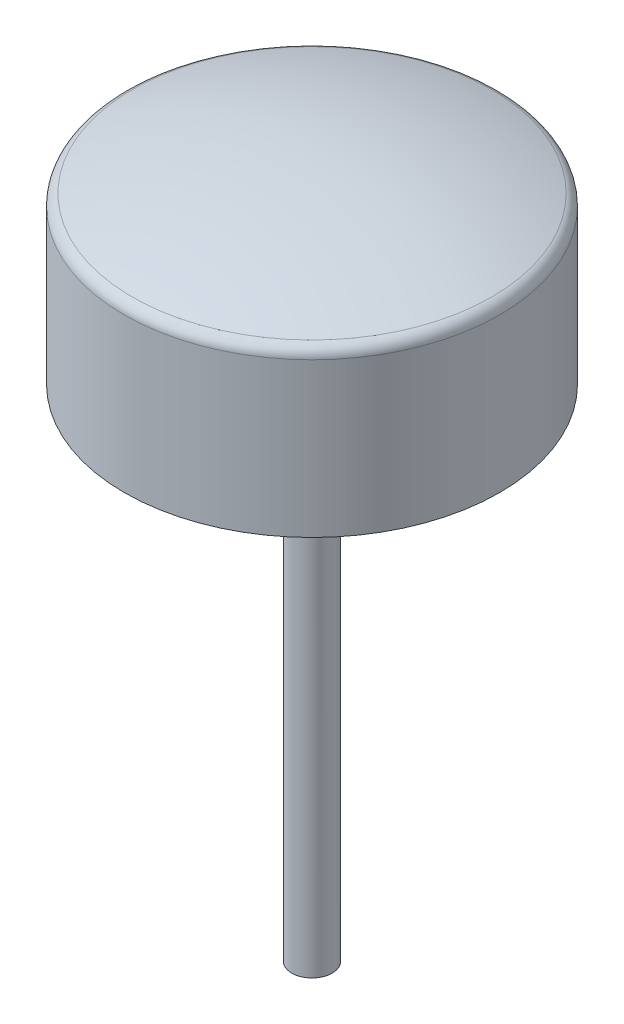
ISO-10303-21;
HEADER;
FILE_DESCRIPTION(('STEP AP214'),'2;1');
FILE_NAME('part.step','',(''),(''),'','','');
FILE_SCHEMA(('AUTOMOTIVE_DESIGN { 1 0 10303 214 1 1 1 1 }'));
ENDSEC;
DATA;
#1=APPLICATION_CONTEXT('core data for automotive mechanical design processes');
#2=APPLICATION_PROTOCOL_DEFINITION('international standard','automotive_design',2000,#1);
#3=PRODUCT_CONTEXT('',#1,'mechanical');
#4=PRODUCT('Part','Part','',(#3));
#5=PRODUCT_RELATED_PRODUCT_CATEGORY('part','',(#4));
#6=PRODUCT_DEFINITION_FORMATION('','',#4);
#7=PRODUCT_DEFINITION_CONTEXT('part definition',#1,'design');
#8=PRODUCT_DEFINITION('design','',#6,#7);
#9=PRODUCT_DEFINITION_SHAPE('','',#8);
#10=(LENGTH_UNIT() NAMED_UNIT(*) SI_UNIT(.MILLI.,.METRE.));
#11=(NAMED_UNIT(*) PLANE_ANGLE_UNIT() SI_UNIT($,.RADIAN.));
#12=(NAMED_UNIT(*) SI_UNIT($,.STERADIAN.) SOLID_ANGLE_UNIT());
#13=UNCERTAINTY_MEASURE_WITH_UNIT(LENGTH_MEASURE(1.E-05),#10,'distance_accuracy_value','');
#14=(GEOMETRIC_REPRESENTATION_CONTEXT(3) GLOBAL_UNCERTAINTY_ASSIGNED_CONTEXT((#13)) GLOBAL_UNIT_ASSIGNED_CONTEXT((#10,
#11,#12)) REPRESENTATION_CONTEXT('',''));
#15=CARTESIAN_POINT('',(0.,0.,0.));
#16=DIRECTION('',(0.,0.,1.));
#17=DIRECTION('',(1.,0.,0.));
#18=AXIS2_PLACEMENT_3D('',#15,#16,#17);
#19=CARTESIAN_POINT('',(0.,0.,0.));
#20=DIRECTION('',(0.,1.,0.));
#21=DIRECTION('',(0.,0.,1.));
#22=AXIS2_PLACEMENT_3D('',#19,#20,#21);
#23=PLANE('',#22);
#24=CARTESIAN_POINT('',(0.,0.,0.));
#25=DIRECTION('',(0.,1.,0.));
#26=DIRECTION('',(0.,0.,1.));
#27=AXIS2_PLACEMENT_3D('',#24,#25,#26);
#28=CIRCLE('',#27,15.395853366767);
#29=CARTESIAN_POINT('',(0.,0.,15.395853366767));
#30=VERTEX_POINT('',#29);
#31=EDGE_CURVE('E55',#30,#30,#28,.T.);
#32=ORIENTED_EDGE('',*,*,#31,.F.);
#33=EDGE_LOOP('',(#32));
#34=FACE_BOUND('',#33,.T.);
#35=CARTESIAN_POINT('',(0.,0.,0.));
#36=DIRECTION('',(0.,1.,0.));
#37=DIRECTION('',(0.,0.,1.));
#38=AXIS2_PLACEMENT_3D('',#35,#36,#37);
#39=CIRCLE('',#38,14.395853366767);
#40=CARTESIAN_POINT('',(0.,0.,14.395853366767));
#41=VERTEX_POINT('',#40);
#42=EDGE_CURVE('E59',#41,#41,#39,.T.);
#43=ORIENTED_EDGE('',*,*,#42,.T.);
#44=EDGE_LOOP('',(#43));
#45=FACE_BOUND('',#44,.T.);
#46=ADVANCED_FACE('F44',(#34,#45),#23,.F.);
#47=CARTESIAN_POINT('',(0.,12.,0.));
#48=DIRECTION('',(0.,-1.,0.));
#49=DIRECTION('',(0.,0.,-1.));
#50=AXIS2_PLACEMENT_3D('',#47,#48,#49);
#51=CYLINDRICAL_SURFACE('',#50,15.395853366767);
#52=CARTESIAN_POINT('',(0.,12.6185909113013,0.));
#53=DIRECTION('',(0.,-1.,0.));
#54=DIRECTION('',(0.,0.,-1.));
#55=AXIS2_PLACEMENT_3D('',#52,#53,#54);
#56=CIRCLE('',#55,15.395853366767);
#57=CARTESIAN_POINT('',(0.,12.6185909113013,-15.395853366767));
#58=VERTEX_POINT('',#57);
#59=EDGE_CURVE('E51',#58,#58,#56,.T.);
#60=ORIENTED_EDGE('',*,*,#59,.T.);
#61=EDGE_LOOP('',(#60));
#62=FACE_BOUND('',#61,.T.);
#63=ORIENTED_EDGE('',*,*,#31,.T.);
#64=EDGE_LOOP('',(#63));
#65=FACE_BOUND('',#64,.T.);
#66=ADVANCED_FACE('F80',(#62,#65),#51,.T.);
#67=CARTESIAN_POINT('',(0.,12.,0.));
#68=DIRECTION('',(0.,-1.,0.));
#69=DIRECTION('',(0.,0.,-1.));
#70=AXIS2_PLACEMENT_3D('',#67,#68,#69);
#71=CYLINDRICAL_SURFACE('',#70,14.395853366767);
#72=CARTESIAN_POINT('',(0.,12.,0.));
#73=DIRECTION('',(0.,1.,0.));
#74=DIRECTION('',(0.,0.,1.));
#75=AXIS2_PLACEMENT_3D('',#72,#73,#74);
#76=CIRCLE('',#75,14.395853366767);
#77=CARTESIAN_POINT('',(0.,12.,14.395853366767));
#78=VERTEX_POINT('',#77);
#79=EDGE_CURVE('E64',#78,#78,#76,.T.);
#80=ORIENTED_EDGE('',*,*,#79,.T.);
#81=EDGE_LOOP('',(#80));
#82=FACE_BOUND('',#81,.T.);
#83=ORIENTED_EDGE('',*,*,#42,.F.);
#84=EDGE_LOOP('',(#83));
#85=FACE_BOUND('',#84,.T.);
#86=ADVANCED_FACE('F68',(#82,#85),#71,.F.);
#87=CARTESIAN_POINT('',(0.,12.,0.));
#88=DIRECTION('',(0.,1.,0.));
#89=DIRECTION('',(0.,0.,1.));
#90=AXIS2_PLACEMENT_3D('',#87,#88,#89);
#91=PLANE('',#90);
#92=ORIENTED_EDGE('',*,*,#79,.F.);
#93=EDGE_LOOP('',(#92));
#94=FACE_BOUND('',#93,.T.);
#95=ADVANCED_FACE('F71',(#94),#91,.F.);
#96=CARTESIAN_POINT('',(0.,-27.0744983867139,0.));
#97=DIRECTION('',(0.,-1.,0.));
#98=DIRECTION('',(1.,0.,0.));
#99=AXIS2_PLACEMENT_3D('',#96,#97,#98);
#100=SPHERICAL_SURFACE('',#99,43.2230024060069);
#101=CARTESIAN_POINT('',(0.,13.5586730238033,0.));
#102=DIRECTION('',(0.,-1.,0.));
#103=DIRECTION('',(0.,0.,-1.));
#104=AXIS2_PLACEMENT_3D('',#101,#102,#103);
#105=CIRCLE('',#104,14.7368014885595);
#106=CARTESIAN_POINT('',(0.,13.5586730238033,-14.7368014885595));
#107=VERTEX_POINT('',#106);
#108=EDGE_CURVE('E11',#107,#107,#105,.F.);
#109=ORIENTED_EDGE('',*,*,#108,.T.);
#110=EDGE_LOOP('',(#109));
#111=FACE_BOUND('',#110,.T.);
#112=ADVANCED_FACE('F73',(#111),#100,.T.);
#113=CARTESIAN_POINT('',(0.,12.6185909113013,0.));
#114=DIRECTION('',(0.,-1.,0.));
#115=DIRECTION('',(0.,0.,-1.));
#116=AXIS2_PLACEMENT_3D('',#113,#114,#115);
#117=TOROIDAL_SURFACE('',#116,14.395853366767,1.);
#118=ORIENTED_EDGE('',*,*,#108,.F.);
#119=EDGE_LOOP('',(#118));
#120=FACE_BOUND('',#119,.T.);
#121=ORIENTED_EDGE('',*,*,#59,.F.);
#122=EDGE_LOOP('',(#121));
#123=FACE_BOUND('',#122,.T.);
#124=ADVANCED_FACE('F46',(#120,#123),#117,.T.);
#125=CLOSED_SHELL('',(#46,#66,#86,#95,#112,#124));
#126=MANIFOLD_SOLID_BREP('B2',#125);
#127=CARTESIAN_POINT('',(0.,0.,0.));
#128=DIRECTION('',(0.353553390593277,0.707106781186546,-0.612372435695794));
#129=DIRECTION('',(0.,0.654653670707977,0.755928946018454));
#130=AXIS2_PLACEMENT_3D('',#127,#128,#129);
#131=PLANE('',#130);
#132=DIRECTION('',(-0.866025403784436,0.,-0.500000000000004));
#133=VECTOR('',#132,1.);
#134=CARTESIAN_POINT('',(0.,0.,0.));
#135=LINE('',#134,#133);
#136=CARTESIAN_POINT('',(1.43668445085662,0.,0.829470154442625));
#137=VERTEX_POINT('',#136);
#138=CARTESIAN_POINT('',(-1.43668445085662,0.,-0.829470154442628));
#139=VERTEX_POINT('',#138);
#140=EDGE_CURVE('E145',#137,#139,#135,.T.);
#141=ORIENTED_EDGE('',*,*,#140,.T.);
#142=CARTESIAN_POINT('',(0.,0.,0.));
#143=DIRECTION('',(0.353553390593277,0.707106781186546,-0.612372435695794));
#144=DIRECTION('',(0.353553390593276,-0.707106781186549,-0.612372435695792));
#145=AXIS2_PLACEMENT_3D('',#142,#143,#144);
#146=ELLIPSE('',#145,2.34609588399292,1.65894030888524);
#147=EDGE_CURVE('E42',#139,#137,#146,.T.);
#148=ORIENTED_EDGE('',*,*,#147,.T.);
#149=EDGE_LOOP('',(#141,#148));
#150=FACE_BOUND('',#149,.T.);
#151=ADVANCED_FACE('F142',(#150),#131,.T.);
#152=CARTESIAN_POINT('',(0.,5.6639765017634,0.));
#153=DIRECTION('',(0.,-1.,0.));
#154=DIRECTION('',(0.,0.,-1.));
#155=AXIS2_PLACEMENT_3D('',#152,#153,#154);
#156=CYLINDRICAL_SURFACE('',#155,1.65894030888524);
#157=ORIENTED_EDGE('',*,*,#147,.F.);
#158=CARTESIAN_POINT('',(0.,0.,0.));
#159=DIRECTION('',(0.,1.,0.));
#160=DIRECTION('',(0.,0.,1.));
#161=AXIS2_PLACEMENT_3D('',#158,#159,#160);
#162=CIRCLE('',#161,1.65894030888524);
#163=EDGE_CURVE('E157',#137,#139,#162,.T.);
#164=ORIENTED_EDGE('',*,*,#163,.F.);
#165=EDGE_LOOP('',(#157,#164));
#166=FACE_BOUND('',#165,.T.);
#167=CARTESIAN_POINT('',(0.,-41.,0.));
#168=DIRECTION('',(0.,1.,0.));
#169=DIRECTION('',(0.,0.,1.));
#170=AXIS2_PLACEMENT_3D('',#167,#168,#169);
#171=CIRCLE('',#170,1.65894030888524);
#172=CARTESIAN_POINT('',(0.,-41.,1.65894030888524));
#173=VERTEX_POINT('',#172);
#174=EDGE_CURVE('E162',#173,#173,#171,.T.);
#175=ORIENTED_EDGE('',*,*,#174,.T.);
#176=EDGE_LOOP('',(#175));
#177=FACE_BOUND('',#176,.T.);
#178=ADVANCED_FACE('F164',(#166,#177),#156,.T.);
#179=CARTESIAN_POINT('',(0.,0.,0.));
#180=DIRECTION('',(0.,1.,0.));
#181=DIRECTION('',(0.,0.,1.));
#182=AXIS2_PLACEMENT_3D('',#179,#180,#181);
#183=PLANE('',#182);
#184=ORIENTED_EDGE('',*,*,#140,.F.);
#185=ORIENTED_EDGE('',*,*,#163,.T.);
#186=EDGE_LOOP('',(#184,#185));
#187=FACE_BOUND('',#186,.T.);
#188=ADVANCED_FACE('F160',(#187),#183,.T.);
#189=CARTESIAN_POINT('',(0.,-41.,0.));
#190=DIRECTION('',(0.,1.,0.));
#191=DIRECTION('',(0.,0.,1.));
#192=AXIS2_PLACEMENT_3D('',#189,#190,#191);
#193=PLANE('',#192);
#194=ORIENTED_EDGE('',*,*,#174,.F.);
#195=EDGE_LOOP('',(#194));
#196=FACE_BOUND('',#195,.T.);
#197=ADVANCED_FACE('F174',(#196),#193,.F.);
#198=CLOSED_SHELL('',(#151,#178,#188,#197));
#199=MANIFOLD_SOLID_BREP('B6',#198);
#200=CARTESIAN_POINT('',(0.,0.,0.));
#201=DIRECTION('',(-0.707106781186549,0.707106781186546,0.));
#202=DIRECTION('',(-0.707106781186546,-0.707106781186549,0.));
#203=AXIS2_PLACEMENT_3D('',#200,#201,#202);
#204=PLANE('',#203);
#205=DIRECTION('',(-0.654653670707975,-0.654653670707978,-0.37796447300923));
#206=VECTOR('',#205,1.);
#207=CARTESIAN_POINT('',(0.,0.,0.));
#208=LINE('',#207,#206);
#209=CARTESIAN_POINT('',(0.707106781186546,0.70710678118655,0.408248290463865));
#210=VERTEX_POINT('',#209);
#211=CARTESIAN_POINT('',(0.,0.,0.));
#212=VERTEX_POINT('',#211);
#213=EDGE_CURVE('E337',#210,#212,#208,.T.);
#214=ORIENTED_EDGE('',*,*,#213,.F.);
#215=DIRECTION('',(0.44721359549996,0.447213595499962,-0.77459666924148));
#216=VECTOR('',#215,1.);
#217=CARTESIAN_POINT('',(0.565685424949233,0.565685424949237,0.653197264742186));
#218=LINE('',#217,#216);
#219=CARTESIAN_POINT('',(1.20684129722849,1.2068412972285,-0.457317281616618));
#220=VERTEX_POINT('',#219);
#221=EDGE_CURVE('E334',#210,#220,#218,.T.);
#222=ORIENTED_EDGE('',*,*,#221,.T.);
#223=DIRECTION('',(0.683012701892217,0.68301270189222,-0.258819045102525));
#224=VECTOR('',#223,1.);
#225=CARTESIAN_POINT('',(0.,0.,0.));
#226=LINE('',#225,#224);
#227=CARTESIAN_POINT('',(9.04991830007188,9.04991830007192,-3.42935234760846));
#228=VERTEX_POINT('',#227);
#229=EDGE_CURVE('E375',#220,#228,#226,.T.);
#230=ORIENTED_EDGE('',*,*,#229,.T.);
#231=CARTESIAN_POINT('',(2.04721952817593,2.04721952817594,2.22156940943339));
#232=DIRECTION('',(-0.707106781186549,0.707106781186546,0.));
#233=DIRECTION('',(-0.707106781186546,-0.707106781186549,0.));
#234=AXIS2_PLACEMENT_3D('',#231,#232,#233);
#235=CIRCLE('',#234,11.4021268579171);
#236=CARTESIAN_POINT('',(0.,0.,13.25));
#237=VERTEX_POINT('',#236);
#238=EDGE_CURVE('E363',#228,#237,#235,.F.);
#239=ORIENTED_EDGE('',*,*,#238,.T.);
#240=DIRECTION('',(0.,0.,1.));
#241=VECTOR('',#240,1.);
#242=CARTESIAN_POINT('',(0.,0.,0.));
#243=LINE('',#242,#241);
#244=EDGE_CURVE('E368',#212,#237,#243,.T.);
#245=ORIENTED_EDGE('',*,*,#244,.F.);
#246=EDGE_LOOP('',(#214,#222,#230,#239,#245));
#247=FACE_BOUND('',#246,.T.);
#248=ADVANCED_FACE('F209',(#247),#204,.F.);
#249=CARTESIAN_POINT('',(0.353553390593277,0.70710678118655,-0.612372435695793));
#250=DIRECTION('',(-0.353553390593276,0.707106781186549,0.612372435695792));
#251=DIRECTION('',(0.,-0.654653670707975,0.755928946018457));
#252=AXIS2_PLACEMENT_3D('',#249,#250,#251);
#253=PLANE('',#252);
#254=DIRECTION('',(0.,0.654653670707978,-0.755928946018454));
#255=VECTOR('',#254,1.);
#256=CARTESIAN_POINT('',(0.,0.606091526731331,-0.699854212223766));
#257=LINE('',#256,#255);
#258=CARTESIAN_POINT('',(0.,0.70710678118655,-0.816496580927725));
#259=VERTEX_POINT('',#258);
#260=EDGE_CURVE('E224',#212,#259,#257,.T.);
#261=ORIENTED_EDGE('',*,*,#260,.F.);
#262=DIRECTION('',(-0.866025403784436,0.,-0.500000000000004));
#263=VECTOR('',#262,1.);
#264=CARTESIAN_POINT('',(0.,0.,0.));
#265=LINE('',#264,#263);
#266=CARTESIAN_POINT('',(-11.4771031718584,0.,-6.62630860578962));
#267=VERTEX_POINT('',#266);
#268=EDGE_CURVE('E339',#212,#267,#265,.T.);
#269=ORIENTED_EDGE('',*,*,#268,.T.);
#270=DIRECTION('',(-0.353553390593277,-0.707106781186546,0.612372435695794));
#271=VECTOR('',#270,1.);
#272=CARTESIAN_POINT('',(-11.1235497812651,0.707106781186547,-7.23868104148542));
#273=LINE('',#272,#271);
#274=CARTESIAN_POINT('',(-11.1235497812651,0.707106781186547,-7.23868104148542));
#275=VERTEX_POINT('',#274);
#276=EDGE_CURVE('E357',#275,#267,#273,.T.);
#277=ORIENTED_EDGE('',*,*,#276,.F.);
#278=DIRECTION('',(-0.866025403784436,0.,-0.500000000000004));
#279=VECTOR('',#278,1.);
#280=CARTESIAN_POINT('',(0.353553390593277,0.70710678118655,-0.612372435695793));
#281=LINE('',#280,#279);
#282=EDGE_CURVE('E340',#259,#275,#281,.T.);
#283=ORIENTED_EDGE('',*,*,#282,.F.);
#284=EDGE_LOOP('',(#261,#269,#277,#283));
#285=FACE_BOUND('',#284,.T.);
#286=ADVANCED_FACE('F395',(#285),#253,.F.);
#287=CARTESIAN_POINT('',(-0.707106781186549,0.707106781186549,0.));
#288=DIRECTION('',(0.707106781186546,0.707106781186549,0.));
#289=DIRECTION('',(-0.707106781186549,0.707106781186546,0.));
#290=AXIS2_PLACEMENT_3D('',#287,#288,#289);
#291=PLANE('',#290);
#292=DIRECTION('',(-0.65465367070798,0.654653670707978,0.377964473009222));
#293=VECTOR('',#292,1.);
#294=CARTESIAN_POINT('',(-0.60609152673133,0.606091526731331,0.349927106111879));
#295=LINE('',#294,#293);
#296=CARTESIAN_POINT('',(-0.707106781186549,0.707106781186549,0.408248290463857));
#297=VERTEX_POINT('',#296);
#298=EDGE_CURVE('E232',#212,#297,#295,.T.);
#299=ORIENTED_EDGE('',*,*,#298,.F.);
#300=ORIENTED_EDGE('',*,*,#244,.T.);
#301=DIRECTION('',(0.707106781186549,-0.707106781186546,0.));
#302=VECTOR('',#301,1.);
#303=CARTESIAN_POINT('',(-0.707106781186549,0.707106781186549,13.25));
#304=LINE('',#303,#302);
#305=CARTESIAN_POINT('',(-0.707106781186549,0.707106781186549,13.25));
#306=VERTEX_POINT('',#305);
#307=EDGE_CURVE('E372',#306,#237,#304,.T.);
#308=ORIENTED_EDGE('',*,*,#307,.F.);
#309=DIRECTION('',(0.,0.,1.));
#310=VECTOR('',#309,1.);
#311=CARTESIAN_POINT('',(-0.707106781186549,0.707106781186549,0.));
#312=LINE('',#311,#310);
#313=EDGE_CURVE('E370',#297,#306,#312,.T.);
#314=ORIENTED_EDGE('',*,*,#313,.F.);
#315=EDGE_LOOP('',(#299,#300,#308,#314));
#316=FACE_BOUND('',#315,.T.);
#317=ADVANCED_FACE('F434',(#316),#291,.F.);
#318=CARTESIAN_POINT('',(1.34011274698938,2.75432630936249,2.22156940943339));
#319=DIRECTION('',(0.707106781186549,-0.707106781186546,0.));
#320=DIRECTION('',(0.707106781186546,0.707106781186549,0.));
#321=AXIS2_PLACEMENT_3D('',#318,#319,#320);
#322=CYLINDRICAL_SURFACE('',#321,11.4021268579171);
#323=ORIENTED_EDGE('',*,*,#238,.F.);
#324=DIRECTION('',(0.707106781186549,-0.707106781186546,0.));
#325=VECTOR('',#324,1.);
#326=CARTESIAN_POINT('',(8.34281151888533,9.75702508125846,-3.42935234760846));
#327=LINE('',#326,#325);
#328=CARTESIAN_POINT('',(8.34281151888533,9.75702508125846,-3.42935234760846));
#329=VERTEX_POINT('',#328);
#330=EDGE_CURVE('E380',#329,#228,#327,.T.);
#331=ORIENTED_EDGE('',*,*,#330,.F.);
#332=CARTESIAN_POINT('',(1.34011274698938,2.75432630936249,2.22156940943339));
#333=DIRECTION('',(-0.707106781186549,0.707106781186546,0.));
#334=DIRECTION('',(-0.707106781186546,-0.707106781186549,0.));
#335=AXIS2_PLACEMENT_3D('',#332,#333,#334);
#336=CIRCLE('',#335,11.4021268579171);
#337=EDGE_CURVE('E364',#329,#306,#336,.F.);
#338=ORIENTED_EDGE('',*,*,#337,.T.);
#339=ORIENTED_EDGE('',*,*,#307,.T.);
#340=EDGE_LOOP('',(#323,#331,#338,#339));
#341=FACE_BOUND('',#340,.T.);
#342=ADVANCED_FACE('F211',(#341),#322,.T.);
#343=CARTESIAN_POINT('',(-0.70710678118655,0.707106781186547,0.));
#344=DIRECTION('',(-0.183012701892222,-0.183012701892223,-0.965925826289067));
#345=DIRECTION('',(0.,0.982520050848697,-0.186156787897389));
#346=AXIS2_PLACEMENT_3D('',#343,#344,#345);
#347=PLANE('',#346);
#348=DIRECTION('',(0.922794434260845,-0.370827964791822,-0.10458036443598));
#349=VECTOR('',#348,1.);
#350=CARTESIAN_POINT('',(-0.296106162109232,1.81080565466599,-0.286988130085086));
#351=LINE('',#350,#349);
#352=CARTESIAN_POINT('',(0.198024191734817,1.61223775410792,-0.342987961212463));
#353=VERTEX_POINT('',#352);
#354=EDGE_CURVE('E332',#353,#220,#351,.T.);
#355=ORIENTED_EDGE('',*,*,#354,.F.);
#356=DIRECTION('',(0.683012701892217,0.68301270189222,-0.258819045102525));
#357=VECTOR('',#356,1.);
#358=CARTESIAN_POINT('',(-0.70710678118655,0.707106781186547,0.));
#359=LINE('',#358,#357);
#360=EDGE_CURVE('E367',#353,#329,#359,.T.);
#361=ORIENTED_EDGE('',*,*,#360,.T.);
#362=ORIENTED_EDGE('',*,*,#330,.T.);
#363=ORIENTED_EDGE('',*,*,#229,.F.);
#364=EDGE_LOOP('',(#355,#361,#362,#363));
#365=FACE_BOUND('',#364,.T.);
#366=ADVANCED_FACE('F411',(#365),#347,.T.);
#367=CARTESIAN_POINT('',(-0.70710678118655,0.707106781186547,0.));
#368=DIRECTION('',(-0.707106781186549,0.707106781186546,0.));
#369=DIRECTION('',(-0.707106781186546,-0.707106781186549,0.));
#370=AXIS2_PLACEMENT_3D('',#367,#368,#369);
#371=PLANE('',#370);
#372=DIRECTION('',(0.44721359549996,0.447213595499962,-0.77459666924148));
#373=VECTOR('',#372,1.);
#374=CARTESIAN_POINT('',(-0.282842712474625,1.13137084989847,0.489897948556638));
#375=LINE('',#374,#373);
#376=CARTESIAN_POINT('',(0.,1.4142135623731,0.));
#377=VERTEX_POINT('',#376);
#378=EDGE_CURVE('E330',#377,#353,#375,.T.);
#379=ORIENTED_EDGE('',*,*,#378,.F.);
#380=DIRECTION('',(-0.447213595499956,-0.447213595499958,-0.774596669241484));
#381=VECTOR('',#380,1.);
#382=CARTESIAN_POINT('',(-0.282842712474619,1.13137084989848,-0.489897948556638));
#383=LINE('',#382,#381);
#384=CARTESIAN_POINT('',(0.198024191734821,1.61223775410792,0.342987961212474));
#385=VERTEX_POINT('',#384);
#386=EDGE_CURVE('E385',#385,#377,#383,.T.);
#387=ORIENTED_EDGE('',*,*,#386,.F.);
#388=DIRECTION('',(0.370827964791831,0.370827964791833,-0.851453604758765));
#389=VECTOR('',#388,1.);
#390=CARTESIAN_POINT('',(0.0573849355994905,1.47159849797259,0.66590805617953));
#391=LINE('',#390,#389);
#392=CARTESIAN_POINT('',(-0.207372265144608,1.20684129722849,1.27381386254435));
#393=VERTEX_POINT('',#392);
#394=EDGE_CURVE('E360',#393,#385,#391,.T.);
#395=ORIENTED_EDGE('',*,*,#394,.F.);
#396=DIRECTION('',(-0.447213595499956,-0.447213595499958,-0.774596669241484));
#397=VECTOR('',#396,1.);
#398=CARTESIAN_POINT('',(-0.848528137423856,0.565685424949241,0.163299316185541));
#399=LINE('',#398,#397);
#400=EDGE_CURVE('E383',#393,#297,#399,.T.);
#401=ORIENTED_EDGE('',*,*,#400,.T.);
#402=ORIENTED_EDGE('',*,*,#313,.T.);
#403=ORIENTED_EDGE('',*,*,#337,.F.);
#404=ORIENTED_EDGE('',*,*,#360,.F.);
#405=EDGE_LOOP('',(#379,#387,#395,#401,#402,#403,#404));
#406=FACE_BOUND('',#405,.T.);
#407=ADVANCED_FACE('F405',(#406),#371,.T.);
#408=CARTESIAN_POINT('',(0.,0.,0.));
#409=DIRECTION('',(0.353553390593277,0.707106781186546,-0.612372435695794));
#410=DIRECTION('',(0.,0.654653670707977,0.755928946018454));
#411=AXIS2_PLACEMENT_3D('',#408,#409,#410);
#412=PLANE('',#411);
#413=ORIENTED_EDGE('',*,*,#268,.F.);
#414=ORIENTED_EDGE('',*,*,#298,.T.);
#415=ORIENTED_EDGE('',*,*,#400,.F.);
#416=DIRECTION('',(-0.117362482904091,0.683012701892219,0.720915873497371));
#417=VECTOR('',#416,1.);
#418=CARTESIAN_POINT('',(0.,0.,0.));
#419=LINE('',#418,#417);
#420=CARTESIAN_POINT('',(-1.81181518234001,10.5441939570304,11.1293344557123));
#421=VERTEX_POINT('',#420);
#422=EDGE_CURVE('E343',#393,#421,#419,.T.);
#423=ORIENTED_EDGE('',*,*,#422,.T.);
#424=CARTESIAN_POINT('',(0.00320268651392286,1.00760244979322,1.16532816316942));
#425=DIRECTION('',(0.353553390593277,0.707106781186546,-0.612372435695794));
#426=DIRECTION('',(0.,0.654653670707977,0.755928946018454));
#427=AXIS2_PLACEMENT_3D('',#424,#425,#426);
#428=CIRCLE('',#427,13.9112288759118);
#429=EDGE_CURVE('E351',#267,#421,#428,.T.);
#430=ORIENTED_EDGE('',*,*,#429,.F.);
#431=EDGE_LOOP('',(#413,#414,#415,#423,#430));
#432=FACE_BOUND('',#431,.T.);
#433=ADVANCED_FACE('F445',(#432),#412,.F.);
#434=CARTESIAN_POINT('',(0.3567560771072,1.71470923097976,0.552955727473629));
#435=DIRECTION('',(-0.353553390593277,-0.707106781186546,0.612372435695794));
#436=DIRECTION('',(0.,-0.654653670707977,-0.755928946018454));
#437=AXIS2_PLACEMENT_3D('',#434,#435,#436);
#438=CYLINDRICAL_SURFACE('',#437,13.9112288759118);
#439=ORIENTED_EDGE('',*,*,#429,.T.);
#440=DIRECTION('',(-0.353553390593277,-0.707106781186546,0.612372435695794));
#441=VECTOR('',#440,1.);
#442=CARTESIAN_POINT('',(-1.45826179174673,11.2513007382169,10.5169620200165));
#443=LINE('',#442,#441);
#444=CARTESIAN_POINT('',(-1.45826179174673,11.2513007382169,10.5169620200165));
#445=VERTEX_POINT('',#444);
#446=EDGE_CURVE('E348',#445,#421,#443,.T.);
#447=ORIENTED_EDGE('',*,*,#446,.F.);
#448=CARTESIAN_POINT('',(0.3567560771072,1.71470923097976,0.552955727473629));
#449=DIRECTION('',(0.353553390593277,0.707106781186546,-0.612372435695794));
#450=DIRECTION('',(0.,0.654653670707977,0.755928946018454));
#451=AXIS2_PLACEMENT_3D('',#448,#449,#450);
#452=CIRCLE('',#451,13.9112288759118);
#453=EDGE_CURVE('E342',#275,#445,#452,.T.);
#454=ORIENTED_EDGE('',*,*,#453,.F.);
#455=ORIENTED_EDGE('',*,*,#276,.T.);
#456=EDGE_LOOP('',(#439,#447,#454,#455));
#457=FACE_BOUND('',#456,.T.);
#458=ADVANCED_FACE('F397',(#457),#438,.T.);
#459=CARTESIAN_POINT('',(0.353553390593279,0.707106781186547,-0.612372435695794));
#460=DIRECTION('',(0.928022654683917,-0.183012701892226,0.324469264090642));
#461=DIRECTION('',(0.3300435180183,0.,-0.943965717711244));
#462=AXIS2_PLACEMENT_3D('',#459,#460,#461);
#463=PLANE('',#462);
#464=ORIENTED_EDGE('',*,*,#422,.F.);
#465=ORIENTED_EDGE('',*,*,#394,.T.);
#466=DIRECTION('',(-0.117362482904091,0.683012701892219,0.720915873497371));
#467=VECTOR('',#466,1.);
#468=CARTESIAN_POINT('',(0.353553390593279,0.707106781186547,-0.612372435695794));
#469=LINE('',#468,#467);
#470=EDGE_CURVE('E346',#385,#445,#469,.T.);
#471=ORIENTED_EDGE('',*,*,#470,.T.);
#472=ORIENTED_EDGE('',*,*,#446,.T.);
#473=EDGE_LOOP('',(#464,#465,#471,#472));
#474=FACE_BOUND('',#473,.T.);
#475=ADVANCED_FACE('F452',(#474),#463,.T.);
#476=CARTESIAN_POINT('',(0.353553390593278,0.707106781186547,-0.612372435695795));
#477=DIRECTION('',(0.353553390593277,0.707106781186546,-0.612372435695794));
#478=DIRECTION('',(0.,0.654653670707977,0.755928946018454));
#479=AXIS2_PLACEMENT_3D('',#476,#477,#478);
#480=PLANE('',#479);
#481=DIRECTION('',(0.894427190999916,-0.447213595499958,0.));
#482=VECTOR('',#481,1.);
#483=CARTESIAN_POINT('',(0.565685424949239,1.13137084989848,0.));
#484=LINE('',#483,#482);
#485=CARTESIAN_POINT('',(-0.396048383469648,1.61223775410792,0.));
#486=VERTEX_POINT('',#485);
#487=EDGE_CURVE('E140',#486,#377,#484,.T.);
#488=ORIENTED_EDGE('',*,*,#487,.F.);
#489=DIRECTION('',(0.551966469469009,0.370827964791831,0.746873240322792));
#490=VECTOR('',#489,1.);
#491=CARTESIAN_POINT('',(-0.605385761035933,1.47159849797259,-0.283257216066071));
#492=LINE('',#491,#490);
#493=CARTESIAN_POINT('',(-0.999469032083883,1.20684129722849,-0.816496580927731));
#494=VERTEX_POINT('',#493);
#495=EDGE_CURVE('E217',#494,#486,#492,.T.);
#496=ORIENTED_EDGE('',*,*,#495,.F.);
#497=DIRECTION('',(0.894427190999916,-0.447213595499958,0.));
#498=VECTOR('',#497,1.);
#499=CARTESIAN_POINT('',(0.282842712474625,0.56568542494924,-0.816496580927723));
#500=LINE('',#499,#498);
#501=EDGE_CURVE('E388',#494,#259,#500,.T.);
#502=ORIENTED_EDGE('',*,*,#501,.T.);
#503=ORIENTED_EDGE('',*,*,#282,.T.);
#504=ORIENTED_EDGE('',*,*,#453,.T.);
#505=ORIENTED_EDGE('',*,*,#470,.F.);
#506=ORIENTED_EDGE('',*,*,#386,.T.);
#507=EDGE_LOOP('',(#488,#496,#502,#503,#504,#505,#506));
#508=FACE_BOUND('',#507,.T.);
#509=ADVANCED_FACE('F391',(#508),#480,.T.);
#510=CARTESIAN_POINT('',(0.353553390593268,0.707106781186548,0.612372435695798));
#511=DIRECTION('',(-0.353553390593276,0.707106781186549,-0.612372435695792));
#512=DIRECTION('',(0.,0.654653670707975,0.755928946018456));
#513=AXIS2_PLACEMENT_3D('',#510,#511,#512);
#514=PLANE('',#513);
#515=DIRECTION('',(0.86602540378444,0.,-0.499999999999998));
#516=VECTOR('',#515,1.);
#517=CARTESIAN_POINT('',(0.353553390593268,0.707106781186548,0.612372435695798));
#518=LINE('',#517,#516);
#519=CARTESIAN_POINT('',(11.1591426203469,0.707106781186626,-5.62623741485495));
#520=VERTEX_POINT('',#519);
#521=EDGE_CURVE('E306',#210,#520,#518,.T.);
#522=ORIENTED_EDGE('',*,*,#521,.F.);
#523=ORIENTED_EDGE('',*,*,#213,.T.);
#524=DIRECTION('',(0.86602540378444,0.,-0.499999999999998));
#525=VECTOR('',#524,1.);
#526=CARTESIAN_POINT('',(0.,0.,0.));
#527=LINE('',#526,#525);
#528=CARTESIAN_POINT('',(10.8055892297536,0.,-6.23860985055074));
#529=VERTEX_POINT('',#528);
#530=EDGE_CURVE('E319',#212,#529,#527,.T.);
#531=ORIENTED_EDGE('',*,*,#530,.T.);
#532=DIRECTION('',(-0.353553390593269,-0.707106781186546,-0.612372435695799));
#533=VECTOR('',#532,1.);
#534=CARTESIAN_POINT('',(11.1591426203469,0.707106781186626,-5.62623741485495));
#535=LINE('',#534,#533);
#536=EDGE_CURVE('E314',#520,#529,#535,.T.);
#537=ORIENTED_EDGE('',*,*,#536,.F.);
#538=EDGE_LOOP('',(#522,#523,#531,#537));
#539=FACE_BOUND('',#538,.T.);
#540=ADVANCED_FACE('F418',(#539),#514,.F.);
#541=CARTESIAN_POINT('',(0.353553390593269,0.707106781186547,0.612372435695799));
#542=DIRECTION('',(0.353553390593269,0.707106781186546,0.612372435695799));
#543=DIRECTION('',(0.,-0.65465367070798,0.755928946018452));
#544=AXIS2_PLACEMENT_3D('',#541,#542,#543);
#545=PLANE('',#544);
#546=ORIENTED_EDGE('',*,*,#221,.F.);
#547=ORIENTED_EDGE('',*,*,#521,.T.);
#548=CARTESIAN_POINT('',(1.06712326003007,3.29197315315307,-2.78435391185727));
#549=DIRECTION('',(0.353553390593269,0.707106781186546,0.612372435695799));
#550=DIRECTION('',(0.,-0.65465367070798,0.755928946018452));
#551=AXIS2_PLACEMENT_3D('',#548,#549,#550);
#552=CIRCLE('',#551,10.7984577961181);
#553=CARTESIAN_POINT('',(-7.14131201099943,9.75702508125844,-5.5104105405359));
#554=VERTEX_POINT('',#553);
#555=EDGE_CURVE('E307',#554,#520,#552,.F.);
#556=ORIENTED_EDGE('',*,*,#555,.F.);
#557=DIRECTION('',(-0.565650218988128,0.683012701892218,-0.462096828394845));
#558=VECTOR('',#557,1.);
#559=CARTESIAN_POINT('',(0.35355339059327,0.707106781186547,0.612372435695798));
#560=LINE('',#559,#558);
#561=EDGE_CURVE('E296',#486,#554,#560,.T.);
#562=ORIENTED_EDGE('',*,*,#561,.F.);
#563=ORIENTED_EDGE('',*,*,#487,.T.);
#564=ORIENTED_EDGE('',*,*,#378,.T.);
#565=ORIENTED_EDGE('',*,*,#354,.T.);
#566=EDGE_LOOP('',(#546,#547,#556,#562,#563,#564,#565));
#567=FACE_BOUND('',#566,.T.);
#568=ADVANCED_FACE('F316',(#567),#545,.T.);
#569=CARTESIAN_POINT('',(0.,0.,0.));
#570=DIRECTION('',(0.353553390593269,0.707106781186546,0.612372435695799));
#571=DIRECTION('',(0.,-0.65465367070798,0.755928946018452));
#572=AXIS2_PLACEMENT_3D('',#569,#570,#571);
#573=PLANE('',#572);
#574=ORIENTED_EDGE('',*,*,#530,.F.);
#575=ORIENTED_EDGE('',*,*,#260,.T.);
#576=ORIENTED_EDGE('',*,*,#501,.F.);
#577=DIRECTION('',(-0.565650218988128,0.683012701892218,-0.462096828394845));
#578=VECTOR('',#577,1.);
#579=CARTESIAN_POINT('',(0.,0.,0.));
#580=LINE('',#579,#578);
#581=CARTESIAN_POINT('',(-7.4948654015927,9.04991830007189,-6.1227829762317));
#582=VERTEX_POINT('',#581);
#583=EDGE_CURVE('E322',#494,#582,#580,.T.);
#584=ORIENTED_EDGE('',*,*,#583,.T.);
#585=CARTESIAN_POINT('',(0.713569869436801,2.58486637196652,-3.39672634755307));
#586=DIRECTION('',(0.353553390593269,0.707106781186546,0.612372435695799));
#587=DIRECTION('',(0.,-0.65465367070798,0.755928946018452));
#588=AXIS2_PLACEMENT_3D('',#585,#586,#587);
#589=CIRCLE('',#588,10.7984577961181);
#590=EDGE_CURVE('E313',#582,#529,#589,.F.);
#591=ORIENTED_EDGE('',*,*,#590,.T.);
#592=EDGE_LOOP('',(#574,#575,#576,#584,#591));
#593=FACE_BOUND('',#592,.T.);
#594=ADVANCED_FACE('F419',(#593),#573,.F.);
#595=CARTESIAN_POINT('',(1.06712326003007,3.29197315315307,-2.78435391185727));
#596=DIRECTION('',(-0.353553390593269,-0.707106781186546,-0.612372435695799));
#597=DIRECTION('',(0.,0.654653670707981,-0.755928946018452));
#598=AXIS2_PLACEMENT_3D('',#595,#596,#597);
#599=CYLINDRICAL_SURFACE('',#598,10.7984577961181);
#600=ORIENTED_EDGE('',*,*,#590,.F.);
#601=DIRECTION('',(-0.353553390593269,-0.707106781186546,-0.612372435695799));
#602=VECTOR('',#601,1.);
#603=CARTESIAN_POINT('',(-7.14131201099943,9.75702508125844,-5.5104105405359));
#604=LINE('',#603,#602);
#605=EDGE_CURVE('E300',#554,#582,#604,.T.);
#606=ORIENTED_EDGE('',*,*,#605,.F.);
#607=ORIENTED_EDGE('',*,*,#555,.T.);
#608=ORIENTED_EDGE('',*,*,#536,.T.);
#609=EDGE_LOOP('',(#600,#606,#607,#608));
#610=FACE_BOUND('',#609,.T.);
#611=ADVANCED_FACE('F311',(#610),#599,.T.);
#612=CARTESIAN_POINT('',(0.35355339059327,0.707106781186547,0.612372435695798));
#613=DIRECTION('',(-0.745009952791697,-0.183012701892229,0.641456562198424));
#614=DIRECTION('',(0.652476532830397,0.,0.757808929813858));
#615=AXIS2_PLACEMENT_3D('',#612,#613,#614);
#616=PLANE('',#615);
#617=ORIENTED_EDGE('',*,*,#583,.F.);
#618=ORIENTED_EDGE('',*,*,#495,.T.);
#619=ORIENTED_EDGE('',*,*,#561,.T.);
#620=ORIENTED_EDGE('',*,*,#605,.T.);
#621=EDGE_LOOP('',(#617,#618,#619,#620));
#622=FACE_BOUND('',#621,.T.);
#623=ADVANCED_FACE('F299',(#622),#616,.T.);
#624=CLOSED_SHELL('',(#248,#286,#317,#342,#366,#407,#433,#458,#475,#509,#540,#568,#594,#611,#623));
#625=MANIFOLD_SOLID_BREP('B36',#624);
#626=ADVANCED_BREP_SHAPE_REPRESENTATION('',(#18,#126,#199,#625),#14);
#627=SHAPE_DEFINITION_REPRESENTATION(#9,#626);
ENDSEC;
END-ISO-10303-21;
